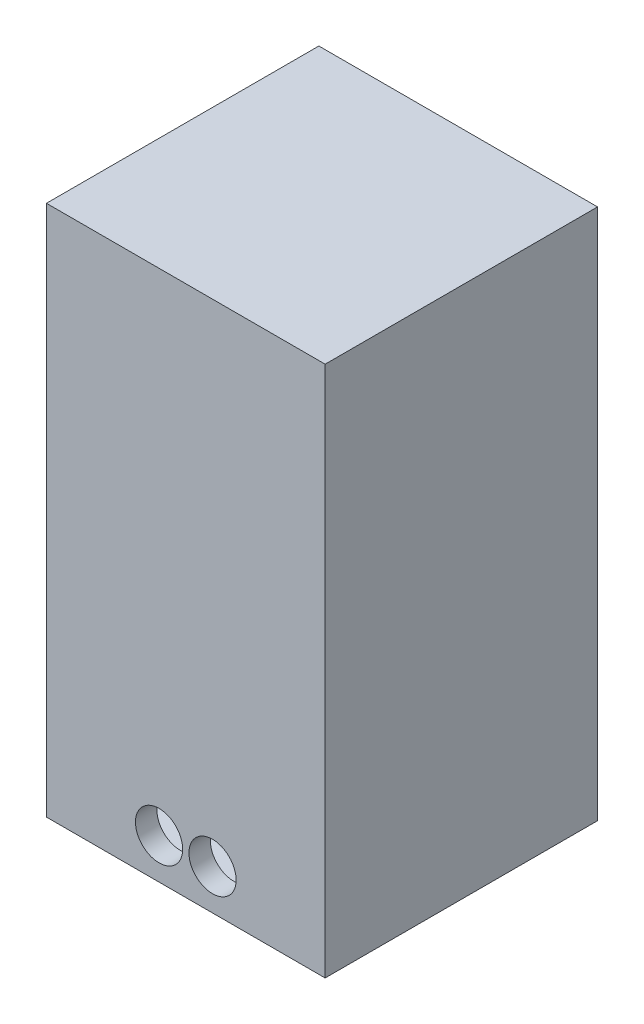
ISO-10303-21;
HEADER;
FILE_DESCRIPTION(('STEP AP214'),'2;1');
FILE_NAME('part.step','',(''),(''),'','','');
FILE_SCHEMA(('AUTOMOTIVE_DESIGN { 1 0 10303 214 1 1 1 1 }'));
ENDSEC;
DATA;
#1=APPLICATION_CONTEXT('core data for automotive mechanical design processes');
#2=APPLICATION_PROTOCOL_DEFINITION('international standard','automotive_design',2000,#1);
#3=PRODUCT_CONTEXT('',#1,'mechanical');
#4=PRODUCT('Part','Part','',(#3));
#5=PRODUCT_RELATED_PRODUCT_CATEGORY('part','',(#4));
#6=PRODUCT_DEFINITION_FORMATION('','',#4);
#7=PRODUCT_DEFINITION_CONTEXT('part definition',#1,'design');
#8=PRODUCT_DEFINITION('design','',#6,#7);
#9=PRODUCT_DEFINITION_SHAPE('','',#8);
#10=(LENGTH_UNIT() NAMED_UNIT(*) SI_UNIT(.MILLI.,.METRE.));
#11=(NAMED_UNIT(*) PLANE_ANGLE_UNIT() SI_UNIT($,.RADIAN.));
#12=(NAMED_UNIT(*) SI_UNIT($,.STERADIAN.) SOLID_ANGLE_UNIT());
#13=UNCERTAINTY_MEASURE_WITH_UNIT(LENGTH_MEASURE(1.E-05),#10,'distance_accuracy_value','');
#14=(GEOMETRIC_REPRESENTATION_CONTEXT(3) GLOBAL_UNCERTAINTY_ASSIGNED_CONTEXT((#13)) GLOBAL_UNIT_ASSIGNED_CONTEXT((#10,
#11,#12)) REPRESENTATION_CONTEXT('',''));
#15=CARTESIAN_POINT('',(0.,0.,0.));
#16=DIRECTION('',(0.,0.,1.));
#17=DIRECTION('',(1.,0.,0.));
#18=AXIS2_PLACEMENT_3D('',#15,#16,#17);
#19=CARTESIAN_POINT('',(0.,0.,433.));
#20=DIRECTION('',(0.,0.,1.));
#21=DIRECTION('',(1.,0.,0.));
#22=AXIS2_PLACEMENT_3D('',#19,#20,#21);
#23=PLANE('',#22);
#24=DIRECTION('',(-1.,0.,0.));
#25=VECTOR('',#24,1.);
#26=CARTESIAN_POINT('',(443.,1672.,433.));
#27=LINE('',#26,#25);
#28=CARTESIAN_POINT('',(443.,1672.,433.));
#29=VERTEX_POINT('',#28);
#30=CARTESIAN_POINT('',(-443.,1672.,433.));
#31=VERTEX_POINT('',#30);
#32=EDGE_CURVE('E249',#29,#31,#27,.T.);
#33=ORIENTED_EDGE('',*,*,#32,.T.);
#34=DIRECTION('',(0.,-1.,0.));
#35=VECTOR('',#34,1.);
#36=CARTESIAN_POINT('',(-443.,1672.,433.));
#37=LINE('',#36,#35);
#38=CARTESIAN_POINT('',(-443.,-18.,433.));
#39=VERTEX_POINT('',#38);
#40=EDGE_CURVE('E275',#31,#39,#37,.T.);
#41=ORIENTED_EDGE('',*,*,#40,.T.);
#42=DIRECTION('',(1.,0.,0.));
#43=VECTOR('',#42,1.);
#44=CARTESIAN_POINT('',(-443.,-18.,433.));
#45=LINE('',#44,#43);
#46=CARTESIAN_POINT('',(443.,-18.,433.));
#47=VERTEX_POINT('',#46);
#48=EDGE_CURVE('E273',#39,#47,#45,.T.);
#49=ORIENTED_EDGE('',*,*,#48,.T.);
#50=DIRECTION('',(0.,1.,0.));
#51=VECTOR('',#50,1.);
#52=CARTESIAN_POINT('',(443.,-18.,433.));
#53=LINE('',#52,#51);
#54=EDGE_CURVE('E259',#47,#29,#53,.T.);
#55=ORIENTED_EDGE('',*,*,#54,.T.);
#56=EDGE_LOOP('',(#33,#41,#49,#55));
#57=FACE_BOUND('',#56,.T.);
#58=CARTESIAN_POINT('',(-85.,110.,433.));
#59=DIRECTION('',(0.,0.,-1.));
#60=DIRECTION('',(-1.,0.,0.));
#61=AXIS2_PLACEMENT_3D('',#58,#59,#60);
#62=CIRCLE('',#61,75.);
#63=CARTESIAN_POINT('',(-160.,110.,433.));
#64=VERTEX_POINT('',#63);
#65=EDGE_CURVE('E427',#64,#64,#62,.T.);
#66=ORIENTED_EDGE('',*,*,#65,.T.);
#67=EDGE_LOOP('',(#66));
#68=FACE_BOUND('',#67,.T.);
#69=CARTESIAN_POINT('',(85.,110.,433.));
#70=DIRECTION('',(0.,0.,-1.));
#71=DIRECTION('',(-1.,0.,0.));
#72=AXIS2_PLACEMENT_3D('',#69,#70,#71);
#73=CIRCLE('',#72,75.);
#74=CARTESIAN_POINT('',(9.99999999999998,110.,433.));
#75=VERTEX_POINT('',#74);
#76=EDGE_CURVE('E417',#75,#75,#73,.T.);
#77=ORIENTED_EDGE('',*,*,#76,.T.);
#78=EDGE_LOOP('',(#77));
#79=FACE_BOUND('',#78,.T.);
#80=ADVANCED_FACE('F39',(#57,#68,#79),#23,.T.);
#81=CARTESIAN_POINT('',(425.,1647.,-415.));
#82=DIRECTION('',(0.,0.,-1.));
#83=DIRECTION('',(0.,1.,0.));
#84=AXIS2_PLACEMENT_3D('',#81,#82,#83);
#85=PLANE('',#84);
#86=DIRECTION('',(1.,0.,0.));
#87=VECTOR('',#86,1.);
#88=CARTESIAN_POINT('',(425.,1630.,-415.));
#89=LINE('',#88,#87);
#90=CARTESIAN_POINT('',(-285.,1630.,-415.));
#91=VERTEX_POINT('',#90);
#92=CARTESIAN_POINT('',(285.,1630.,-415.));
#93=VERTEX_POINT('',#92);
#94=EDGE_CURVE('E50',#91,#93,#89,.T.);
#95=ORIENTED_EDGE('',*,*,#94,.T.);
#96=CARTESIAN_POINT('',(285.,1615.,-415.));
#97=DIRECTION('',(0.,0.,-1.));
#98=DIRECTION('',(0.,1.,0.));
#99=AXIS2_PLACEMENT_3D('',#96,#97,#98);
#100=CIRCLE('',#99,15.0000000000001);
#101=CARTESIAN_POINT('',(300.,1615.,-415.));
#102=VERTEX_POINT('',#101);
#103=EDGE_CURVE('E11',#93,#102,#100,.T.);
#104=ORIENTED_EDGE('',*,*,#103,.T.);
#105=DIRECTION('',(0.,-1.,0.));
#106=VECTOR('',#105,1.);
#107=CARTESIAN_POINT('',(300.,1647.,-415.));
#108=LINE('',#107,#106);
#109=CARTESIAN_POINT('',(300.,1605.,-415.));
#110=VERTEX_POINT('',#109);
#111=EDGE_CURVE('E285',#102,#110,#108,.T.);
#112=ORIENTED_EDGE('',*,*,#111,.T.);
#113=CARTESIAN_POINT('',(285.,1605.,-415.));
#114=DIRECTION('',(0.,0.,-1.));
#115=DIRECTION('',(0.,1.,0.));
#116=AXIS2_PLACEMENT_3D('',#113,#114,#115);
#117=CIRCLE('',#116,14.9999999999997);
#118=CARTESIAN_POINT('',(285.,1590.,-415.));
#119=VERTEX_POINT('',#118);
#120=EDGE_CURVE('E287',#110,#119,#117,.T.);
#121=ORIENTED_EDGE('',*,*,#120,.T.);
#122=DIRECTION('',(-1.,0.,0.));
#123=VECTOR('',#122,1.);
#124=CARTESIAN_POINT('',(425.,1590.,-415.));
#125=LINE('',#124,#123);
#126=CARTESIAN_POINT('',(-285.,1590.,-415.));
#127=VERTEX_POINT('',#126);
#128=EDGE_CURVE('E291',#119,#127,#125,.T.);
#129=ORIENTED_EDGE('',*,*,#128,.T.);
#130=CARTESIAN_POINT('',(-285.,1605.,-415.));
#131=DIRECTION('',(0.,0.,-1.));
#132=DIRECTION('',(0.,1.,0.));
#133=AXIS2_PLACEMENT_3D('',#130,#131,#132);
#134=CIRCLE('',#133,14.9999999999997);
#135=CARTESIAN_POINT('',(-300.,1605.,-415.));
#136=VERTEX_POINT('',#135);
#137=EDGE_CURVE('E298',#127,#136,#134,.T.);
#138=ORIENTED_EDGE('',*,*,#137,.T.);
#139=DIRECTION('',(0.,1.,0.));
#140=VECTOR('',#139,1.);
#141=CARTESIAN_POINT('',(-299.999999999999,1647.,-415.));
#142=LINE('',#141,#140);
#143=CARTESIAN_POINT('',(-300.,1615.,-415.));
#144=VERTEX_POINT('',#143);
#145=EDGE_CURVE('E299',#136,#144,#142,.T.);
#146=ORIENTED_EDGE('',*,*,#145,.T.);
#147=CARTESIAN_POINT('',(-285.,1615.,-415.));
#148=DIRECTION('',(0.,0.,-1.));
#149=DIRECTION('',(0.,1.,0.));
#150=AXIS2_PLACEMENT_3D('',#147,#148,#149);
#151=CIRCLE('',#150,15.);
#152=EDGE_CURVE('E305',#144,#91,#151,.T.);
#153=ORIENTED_EDGE('',*,*,#152,.T.);
#154=EDGE_LOOP('',(#95,#104,#112,#121,#129,#138,#146,#153));
#155=FACE_BOUND('',#154,.T.);
#156=DIRECTION('',(0.,-1.,0.));
#157=VECTOR('',#156,1.);
#158=CARTESIAN_POINT('',(-425.,1647.,-415.));
#159=LINE('',#158,#157);
#160=CARTESIAN_POINT('',(-425.,1647.,-415.));
#161=VERTEX_POINT('',#160);
#162=CARTESIAN_POINT('',(-425.,6.9999999999999,-415.));
#163=VERTEX_POINT('',#162);
#164=EDGE_CURVE('E208',#161,#163,#159,.T.);
#165=ORIENTED_EDGE('',*,*,#164,.T.);
#166=DIRECTION('',(-1.,0.,0.));
#167=VECTOR('',#166,1.);
#168=CARTESIAN_POINT('',(425.,6.9999999999999,-415.));
#169=LINE('',#168,#167);
#170=CARTESIAN_POINT('',(425.,6.9999999999999,-415.));
#171=VERTEX_POINT('',#170);
#172=EDGE_CURVE('E240',#171,#163,#169,.T.);
#173=ORIENTED_EDGE('',*,*,#172,.F.);
#174=DIRECTION('',(0.,-1.,0.));
#175=VECTOR('',#174,1.);
#176=CARTESIAN_POINT('',(425.,1647.,-415.));
#177=LINE('',#176,#175);
#178=CARTESIAN_POINT('',(425.,1647.,-415.));
#179=VERTEX_POINT('',#178);
#180=EDGE_CURVE('E224',#179,#171,#177,.T.);
#181=ORIENTED_EDGE('',*,*,#180,.F.);
#182=DIRECTION('',(-1.,0.,0.));
#183=VECTOR('',#182,1.);
#184=CARTESIAN_POINT('',(425.,1647.,-415.));
#185=LINE('',#184,#183);
#186=EDGE_CURVE('E247',#179,#161,#185,.T.);
#187=ORIENTED_EDGE('',*,*,#186,.T.);
#188=EDGE_LOOP('',(#165,#173,#181,#187));
#189=FACE_BOUND('',#188,.T.);
#190=ADVANCED_FACE('F306',(#155,#189),#85,.F.);
#191=CARTESIAN_POINT('',(425.,1647.,415.));
#192=DIRECTION('',(0.,1.,0.));
#193=DIRECTION('',(0.,0.,1.));
#194=AXIS2_PLACEMENT_3D('',#191,#192,#193);
#195=PLANE('',#194);
#196=DIRECTION('',(0.,0.,-1.));
#197=VECTOR('',#196,1.);
#198=CARTESIAN_POINT('',(-425.,1647.,415.));
#199=LINE('',#198,#197);
#200=CARTESIAN_POINT('',(-425.,1647.,415.));
#201=VERTEX_POINT('',#200);
#202=EDGE_CURVE('E226',#201,#161,#199,.T.);
#203=ORIENTED_EDGE('',*,*,#202,.T.);
#204=ORIENTED_EDGE('',*,*,#186,.F.);
#205=DIRECTION('',(0.,0.,-1.));
#206=VECTOR('',#205,1.);
#207=CARTESIAN_POINT('',(425.,1647.,415.));
#208=LINE('',#207,#206);
#209=CARTESIAN_POINT('',(425.,1647.,415.));
#210=VERTEX_POINT('',#209);
#211=EDGE_CURVE('E234',#210,#179,#208,.T.);
#212=ORIENTED_EDGE('',*,*,#211,.F.);
#213=DIRECTION('',(-1.,0.,0.));
#214=VECTOR('',#213,1.);
#215=CARTESIAN_POINT('',(425.,1647.,415.));
#216=LINE('',#215,#214);
#217=EDGE_CURVE('E252',#210,#201,#216,.T.);
#218=ORIENTED_EDGE('',*,*,#217,.T.);
#219=EDGE_LOOP('',(#203,#204,#212,#218));
#220=FACE_BOUND('',#219,.T.);
#221=ADVANCED_FACE('F346',(#220),#195,.F.);
#222=CARTESIAN_POINT('',(425.,6.9999999999999,415.));
#223=DIRECTION('',(0.,0.,1.));
#224=DIRECTION('',(0.,-1.,0.));
#225=AXIS2_PLACEMENT_3D('',#222,#223,#224);
#226=PLANE('',#225);
#227=CARTESIAN_POINT('',(-85.,110.,415.));
#228=DIRECTION('',(0.,0.,-1.));
#229=DIRECTION('',(1.,0.,0.));
#230=AXIS2_PLACEMENT_3D('',#227,#228,#229);
#231=CIRCLE('',#230,90.);
#232=CARTESIAN_POINT('',(0.,80.419601084502,415.));
#233=VERTEX_POINT('',#232);
#234=CARTESIAN_POINT('',(0.,139.580398915498,415.));
#235=VERTEX_POINT('',#234);
#236=EDGE_CURVE('E179',#233,#235,#231,.T.);
#237=ORIENTED_EDGE('',*,*,#236,.F.);
#238=CARTESIAN_POINT('',(85.,110.,415.));
#239=DIRECTION('',(0.,0.,-1.));
#240=DIRECTION('',(1.,0.,0.));
#241=AXIS2_PLACEMENT_3D('',#238,#239,#240);
#242=CIRCLE('',#241,90.);
#243=EDGE_CURVE('E52',#235,#233,#242,.T.);
#244=ORIENTED_EDGE('',*,*,#243,.F.);
#245=EDGE_LOOP('',(#237,#244));
#246=FACE_BOUND('',#245,.T.);
#247=DIRECTION('',(0.,1.,0.));
#248=VECTOR('',#247,1.);
#249=CARTESIAN_POINT('',(-425.,6.9999999999999,415.));
#250=LINE('',#249,#248);
#251=CARTESIAN_POINT('',(-425.,6.9999999999999,415.));
#252=VERTEX_POINT('',#251);
#253=EDGE_CURVE('E243',#252,#201,#250,.T.);
#254=ORIENTED_EDGE('',*,*,#253,.T.);
#255=ORIENTED_EDGE('',*,*,#217,.F.);
#256=DIRECTION('',(0.,1.,0.));
#257=VECTOR('',#256,1.);
#258=CARTESIAN_POINT('',(425.,6.9999999999999,415.));
#259=LINE('',#258,#257);
#260=CARTESIAN_POINT('',(425.,6.9999999999999,415.));
#261=VERTEX_POINT('',#260);
#262=EDGE_CURVE('E233',#261,#210,#259,.T.);
#263=ORIENTED_EDGE('',*,*,#262,.F.);
#264=DIRECTION('',(-1.,0.,0.));
#265=VECTOR('',#264,1.);
#266=CARTESIAN_POINT('',(425.,6.9999999999999,415.));
#267=LINE('',#266,#265);
#268=EDGE_CURVE('E254',#261,#252,#267,.T.);
#269=ORIENTED_EDGE('',*,*,#268,.T.);
#270=EDGE_LOOP('',(#254,#255,#263,#269));
#271=FACE_BOUND('',#270,.T.);
#272=ADVANCED_FACE('F538',(#246,#271),#226,.F.);
#273=CARTESIAN_POINT('',(425.,6.9999999999999,-415.));
#274=DIRECTION('',(0.,-1.,0.));
#275=DIRECTION('',(0.,0.,-1.));
#276=AXIS2_PLACEMENT_3D('',#273,#274,#275);
#277=PLANE('',#276);
#278=DIRECTION('',(0.,0.,1.));
#279=VECTOR('',#278,1.);
#280=CARTESIAN_POINT('',(-425.,6.9999999999999,-415.));
#281=LINE('',#280,#279);
#282=EDGE_CURVE('E239',#163,#252,#281,.T.);
#283=ORIENTED_EDGE('',*,*,#282,.T.);
#284=ORIENTED_EDGE('',*,*,#268,.F.);
#285=DIRECTION('',(0.,0.,1.));
#286=VECTOR('',#285,1.);
#287=CARTESIAN_POINT('',(425.,6.9999999999999,-415.));
#288=LINE('',#287,#286);
#289=EDGE_CURVE('E227',#171,#261,#288,.T.);
#290=ORIENTED_EDGE('',*,*,#289,.F.);
#291=ORIENTED_EDGE('',*,*,#172,.T.);
#292=EDGE_LOOP('',(#283,#284,#290,#291));
#293=FACE_BOUND('',#292,.T.);
#294=ADVANCED_FACE('F527',(#293),#277,.F.);
#295=CARTESIAN_POINT('',(425.,0.,0.));
#296=DIRECTION('',(-1.,0.,0.));
#297=DIRECTION('',(0.,0.,1.));
#298=AXIS2_PLACEMENT_3D('',#295,#296,#297);
#299=PLANE('',#298);
#300=ORIENTED_EDGE('',*,*,#180,.T.);
#301=ORIENTED_EDGE('',*,*,#289,.T.);
#302=ORIENTED_EDGE('',*,*,#262,.T.);
#303=ORIENTED_EDGE('',*,*,#211,.T.);
#304=EDGE_LOOP('',(#300,#301,#302,#303));
#305=FACE_BOUND('',#304,.T.);
#306=ADVANCED_FACE('F337',(#305),#299,.T.);
#307=CARTESIAN_POINT('',(-425.,0.,0.));
#308=DIRECTION('',(-1.,0.,0.));
#309=DIRECTION('',(0.,0.,1.));
#310=AXIS2_PLACEMENT_3D('',#307,#308,#309);
#311=PLANE('',#310);
#312=ORIENTED_EDGE('',*,*,#164,.F.);
#313=ORIENTED_EDGE('',*,*,#202,.F.);
#314=ORIENTED_EDGE('',*,*,#253,.F.);
#315=ORIENTED_EDGE('',*,*,#282,.F.);
#316=EDGE_LOOP('',(#312,#313,#314,#315));
#317=FACE_BOUND('',#316,.T.);
#318=ADVANCED_FACE('F326',(#317),#311,.F.);
#319=CARTESIAN_POINT('',(285.,1615.,-145.));
#320=DIRECTION('',(0.,0.,-1.));
#321=DIRECTION('',(-1.,0.,0.));
#322=AXIS2_PLACEMENT_3D('',#319,#320,#321);
#323=CYLINDRICAL_SURFACE('',#322,15.0000000000001);
#324=DIRECTION('',(0.,0.,-1.));
#325=VECTOR('',#324,1.);
#326=CARTESIAN_POINT('',(285.,1630.,-145.));
#327=LINE('',#326,#325);
#328=CARTESIAN_POINT('',(285.,1630.,-433.));
#329=VERTEX_POINT('',#328);
#330=EDGE_CURVE('E206',#93,#329,#327,.T.);
#331=ORIENTED_EDGE('',*,*,#330,.T.);
#332=CARTESIAN_POINT('',(285.,1615.,-433.));
#333=DIRECTION('',(0.,0.,-1.));
#334=DIRECTION('',(-1.,0.,0.));
#335=AXIS2_PLACEMENT_3D('',#332,#333,#334);
#336=CIRCLE('',#335,15.0000000000001);
#337=CARTESIAN_POINT('',(300.,1615.,-433.));
#338=VERTEX_POINT('',#337);
#339=EDGE_CURVE('E61',#329,#338,#336,.T.);
#340=ORIENTED_EDGE('',*,*,#339,.T.);
#341=DIRECTION('',(0.,0.,-1.));
#342=VECTOR('',#341,1.);
#343=CARTESIAN_POINT('',(300.,1615.,-145.));
#344=LINE('',#343,#342);
#345=EDGE_CURVE('E210',#102,#338,#344,.T.);
#346=ORIENTED_EDGE('',*,*,#345,.F.);
#347=ORIENTED_EDGE('',*,*,#103,.F.);
#348=EDGE_LOOP('',(#331,#340,#346,#347));
#349=FACE_BOUND('',#348,.T.);
#350=ADVANCED_FACE('F328',(#349),#323,.F.);
#351=CARTESIAN_POINT('',(-285.,1630.,-145.));
#352=DIRECTION('',(0.,1.,0.));
#353=DIRECTION('',(0.,0.,1.));
#354=AXIS2_PLACEMENT_3D('',#351,#352,#353);
#355=PLANE('',#354);
#356=DIRECTION('',(0.,0.,-1.));
#357=VECTOR('',#356,1.);
#358=CARTESIAN_POINT('',(-285.,1630.,-145.));
#359=LINE('',#358,#357);
#360=CARTESIAN_POINT('',(-285.,1630.,-433.));
#361=VERTEX_POINT('',#360);
#362=EDGE_CURVE('E211',#91,#361,#359,.T.);
#363=ORIENTED_EDGE('',*,*,#362,.T.);
#364=DIRECTION('',(1.,0.,0.));
#365=VECTOR('',#364,1.);
#366=CARTESIAN_POINT('',(-285.,1630.,-433.));
#367=LINE('',#366,#365);
#368=EDGE_CURVE('E204',#361,#329,#367,.T.);
#369=ORIENTED_EDGE('',*,*,#368,.T.);
#370=ORIENTED_EDGE('',*,*,#330,.F.);
#371=ORIENTED_EDGE('',*,*,#94,.F.);
#372=EDGE_LOOP('',(#363,#369,#370,#371));
#373=FACE_BOUND('',#372,.T.);
#374=ADVANCED_FACE('F311',(#373),#355,.F.);
#375=CARTESIAN_POINT('',(-285.,1615.,-145.));
#376=DIRECTION('',(0.,0.,-1.));
#377=DIRECTION('',(-1.,0.,0.));
#378=AXIS2_PLACEMENT_3D('',#375,#376,#377);
#379=CYLINDRICAL_SURFACE('',#378,15.);
#380=DIRECTION('',(0.,0.,-1.));
#381=VECTOR('',#380,1.);
#382=CARTESIAN_POINT('',(-300.,1615.,-145.));
#383=LINE('',#382,#381);
#384=CARTESIAN_POINT('',(-300.,1615.,-433.));
#385=VERTEX_POINT('',#384);
#386=EDGE_CURVE('E212',#144,#385,#383,.T.);
#387=ORIENTED_EDGE('',*,*,#386,.T.);
#388=CARTESIAN_POINT('',(-285.,1615.,-433.));
#389=DIRECTION('',(0.,0.,-1.));
#390=DIRECTION('',(-1.,0.,0.));
#391=AXIS2_PLACEMENT_3D('',#388,#389,#390);
#392=CIRCLE('',#391,15.);
#393=EDGE_CURVE('E203',#385,#361,#392,.T.);
#394=ORIENTED_EDGE('',*,*,#393,.T.);
#395=ORIENTED_EDGE('',*,*,#362,.F.);
#396=ORIENTED_EDGE('',*,*,#152,.F.);
#397=EDGE_LOOP('',(#387,#394,#395,#396));
#398=FACE_BOUND('',#397,.T.);
#399=ADVANCED_FACE('F312',(#398),#379,.F.);
#400=CARTESIAN_POINT('',(-300.,1605.,-145.));
#401=DIRECTION('',(-1.,0.,0.));
#402=DIRECTION('',(0.,-1.,0.));
#403=AXIS2_PLACEMENT_3D('',#400,#401,#402);
#404=PLANE('',#403);
#405=DIRECTION('',(0.,0.,-1.));
#406=VECTOR('',#405,1.);
#407=CARTESIAN_POINT('',(-300.,1605.,-145.));
#408=LINE('',#407,#406);
#409=CARTESIAN_POINT('',(-300.,1605.,-433.));
#410=VERTEX_POINT('',#409);
#411=EDGE_CURVE('E214',#136,#410,#408,.T.);
#412=ORIENTED_EDGE('',*,*,#411,.T.);
#413=DIRECTION('',(0.,1.,0.));
#414=VECTOR('',#413,1.);
#415=CARTESIAN_POINT('',(-300.,1605.,-433.));
#416=LINE('',#415,#414);
#417=EDGE_CURVE('E196',#410,#385,#416,.T.);
#418=ORIENTED_EDGE('',*,*,#417,.T.);
#419=ORIENTED_EDGE('',*,*,#386,.F.);
#420=ORIENTED_EDGE('',*,*,#145,.F.);
#421=EDGE_LOOP('',(#412,#418,#419,#420));
#422=FACE_BOUND('',#421,.T.);
#423=ADVANCED_FACE('F396',(#422),#404,.F.);
#424=CARTESIAN_POINT('',(-285.,1605.,-145.));
#425=DIRECTION('',(0.,0.,-1.));
#426=DIRECTION('',(-1.,0.,0.));
#427=AXIS2_PLACEMENT_3D('',#424,#425,#426);
#428=CYLINDRICAL_SURFACE('',#427,14.9999999999997);
#429=DIRECTION('',(0.,0.,-1.));
#430=VECTOR('',#429,1.);
#431=CARTESIAN_POINT('',(-285.,1590.,-145.));
#432=LINE('',#431,#430);
#433=CARTESIAN_POINT('',(-285.,1590.,-433.));
#434=VERTEX_POINT('',#433);
#435=EDGE_CURVE('E220',#127,#434,#432,.T.);
#436=ORIENTED_EDGE('',*,*,#435,.T.);
#437=CARTESIAN_POINT('',(-285.,1605.,-433.));
#438=DIRECTION('',(0.,0.,-1.));
#439=DIRECTION('',(-1.,0.,0.));
#440=AXIS2_PLACEMENT_3D('',#437,#438,#439);
#441=CIRCLE('',#440,14.9999999999997);
#442=EDGE_CURVE('E194',#434,#410,#441,.T.);
#443=ORIENTED_EDGE('',*,*,#442,.T.);
#444=ORIENTED_EDGE('',*,*,#411,.F.);
#445=ORIENTED_EDGE('',*,*,#137,.F.);
#446=EDGE_LOOP('',(#436,#443,#444,#445));
#447=FACE_BOUND('',#446,.T.);
#448=ADVANCED_FACE('F392',(#447),#428,.F.);
#449=CARTESIAN_POINT('',(285.,1590.,-145.));
#450=DIRECTION('',(0.,-1.,0.));
#451=DIRECTION('',(0.,0.,-1.));
#452=AXIS2_PLACEMENT_3D('',#449,#450,#451);
#453=PLANE('',#452);
#454=DIRECTION('',(0.,0.,-1.));
#455=VECTOR('',#454,1.);
#456=CARTESIAN_POINT('',(285.,1590.,-145.));
#457=LINE('',#456,#455);
#458=CARTESIAN_POINT('',(285.,1590.,-433.));
#459=VERTEX_POINT('',#458);
#460=EDGE_CURVE('E217',#119,#459,#457,.T.);
#461=ORIENTED_EDGE('',*,*,#460,.T.);
#462=DIRECTION('',(-1.,0.,0.));
#463=VECTOR('',#462,1.);
#464=CARTESIAN_POINT('',(285.,1590.,-433.));
#465=LINE('',#464,#463);
#466=EDGE_CURVE('E195',#459,#434,#465,.T.);
#467=ORIENTED_EDGE('',*,*,#466,.T.);
#468=ORIENTED_EDGE('',*,*,#435,.F.);
#469=ORIENTED_EDGE('',*,*,#128,.F.);
#470=EDGE_LOOP('',(#461,#467,#468,#469));
#471=FACE_BOUND('',#470,.T.);
#472=ADVANCED_FACE('F387',(#471),#453,.F.);
#473=CARTESIAN_POINT('',(285.,1605.,-145.));
#474=DIRECTION('',(0.,0.,-1.));
#475=DIRECTION('',(-1.,0.,0.));
#476=AXIS2_PLACEMENT_3D('',#473,#474,#475);
#477=CYLINDRICAL_SURFACE('',#476,14.9999999999997);
#478=DIRECTION('',(0.,0.,-1.));
#479=VECTOR('',#478,1.);
#480=CARTESIAN_POINT('',(300.,1605.,-145.));
#481=LINE('',#480,#479);
#482=CARTESIAN_POINT('',(300.,1605.,-433.));
#483=VERTEX_POINT('',#482);
#484=EDGE_CURVE('E223',#110,#483,#481,.T.);
#485=ORIENTED_EDGE('',*,*,#484,.T.);
#486=CARTESIAN_POINT('',(285.,1605.,-433.));
#487=DIRECTION('',(0.,0.,-1.));
#488=DIRECTION('',(-1.,0.,0.));
#489=AXIS2_PLACEMENT_3D('',#486,#487,#488);
#490=CIRCLE('',#489,14.9999999999997);
#491=EDGE_CURVE('E186',#483,#459,#490,.T.);
#492=ORIENTED_EDGE('',*,*,#491,.T.);
#493=ORIENTED_EDGE('',*,*,#460,.F.);
#494=ORIENTED_EDGE('',*,*,#120,.F.);
#495=EDGE_LOOP('',(#485,#492,#493,#494));
#496=FACE_BOUND('',#495,.T.);
#497=ADVANCED_FACE('F381',(#496),#477,.F.);
#498=CARTESIAN_POINT('',(300.,1615.,-145.));
#499=DIRECTION('',(1.,0.,0.));
#500=DIRECTION('',(0.,1.,0.));
#501=AXIS2_PLACEMENT_3D('',#498,#499,#500);
#502=PLANE('',#501);
#503=ORIENTED_EDGE('',*,*,#345,.T.);
#504=DIRECTION('',(0.,-1.,0.));
#505=VECTOR('',#504,1.);
#506=CARTESIAN_POINT('',(300.,1615.,-433.));
#507=LINE('',#506,#505);
#508=EDGE_CURVE('E185',#338,#483,#507,.T.);
#509=ORIENTED_EDGE('',*,*,#508,.T.);
#510=ORIENTED_EDGE('',*,*,#484,.F.);
#511=ORIENTED_EDGE('',*,*,#111,.F.);
#512=EDGE_LOOP('',(#503,#509,#510,#511));
#513=FACE_BOUND('',#512,.T.);
#514=ADVANCED_FACE('F323',(#513),#502,.F.);
#515=CARTESIAN_POINT('',(0.,0.,-433.));
#516=DIRECTION('',(0.,0.,1.));
#517=DIRECTION('',(1.,0.,0.));
#518=AXIS2_PLACEMENT_3D('',#515,#516,#517);
#519=PLANE('',#518);
#520=DIRECTION('',(-1.,0.,0.));
#521=VECTOR('',#520,1.);
#522=CARTESIAN_POINT('',(443.,1672.,-433.));
#523=LINE('',#522,#521);
#524=CARTESIAN_POINT('',(443.,1672.,-433.));
#525=VERTEX_POINT('',#524);
#526=CARTESIAN_POINT('',(-443.,1672.,-433.));
#527=VERTEX_POINT('',#526);
#528=EDGE_CURVE('E256',#525,#527,#523,.T.);
#529=ORIENTED_EDGE('',*,*,#528,.F.);
#530=DIRECTION('',(0.,1.,0.));
#531=VECTOR('',#530,1.);
#532=CARTESIAN_POINT('',(443.,-18.,-433.));
#533=LINE('',#532,#531);
#534=CARTESIAN_POINT('',(443.,-18.,-433.));
#535=VERTEX_POINT('',#534);
#536=EDGE_CURVE('E268',#535,#525,#533,.T.);
#537=ORIENTED_EDGE('',*,*,#536,.F.);
#538=DIRECTION('',(1.,0.,0.));
#539=VECTOR('',#538,1.);
#540=CARTESIAN_POINT('',(-443.,-18.,-433.));
#541=LINE('',#540,#539);
#542=CARTESIAN_POINT('',(-443.,-18.,-433.));
#543=VERTEX_POINT('',#542);
#544=EDGE_CURVE('E261',#543,#535,#541,.T.);
#545=ORIENTED_EDGE('',*,*,#544,.F.);
#546=DIRECTION('',(0.,-1.,0.));
#547=VECTOR('',#546,1.);
#548=CARTESIAN_POINT('',(-443.,1672.,-433.));
#549=LINE('',#548,#547);
#550=EDGE_CURVE('E258',#527,#543,#549,.T.);
#551=ORIENTED_EDGE('',*,*,#550,.F.);
#552=EDGE_LOOP('',(#529,#537,#545,#551));
#553=FACE_BOUND('',#552,.T.);
#554=ORIENTED_EDGE('',*,*,#339,.F.);
#555=ORIENTED_EDGE('',*,*,#368,.F.);
#556=ORIENTED_EDGE('',*,*,#393,.F.);
#557=ORIENTED_EDGE('',*,*,#417,.F.);
#558=ORIENTED_EDGE('',*,*,#442,.F.);
#559=ORIENTED_EDGE('',*,*,#466,.F.);
#560=ORIENTED_EDGE('',*,*,#491,.F.);
#561=ORIENTED_EDGE('',*,*,#508,.F.);
#562=EDGE_LOOP('',(#554,#555,#556,#557,#558,#559,#560,#561));
#563=FACE_BOUND('',#562,.T.);
#564=ADVANCED_FACE('F316',(#553,#563),#519,.F.);
#565=CARTESIAN_POINT('',(443.,1672.,-433.));
#566=DIRECTION('',(0.,1.,0.));
#567=DIRECTION('',(-1.,0.,0.));
#568=AXIS2_PLACEMENT_3D('',#565,#566,#567);
#569=PLANE('',#568);
#570=ORIENTED_EDGE('',*,*,#32,.F.);
#571=DIRECTION('',(0.,0.,1.));
#572=VECTOR('',#571,1.);
#573=CARTESIAN_POINT('',(443.,1672.,-433.));
#574=LINE('',#573,#572);
#575=EDGE_CURVE('E279',#525,#29,#574,.T.);
#576=ORIENTED_EDGE('',*,*,#575,.F.);
#577=ORIENTED_EDGE('',*,*,#528,.T.);
#578=DIRECTION('',(0.,0.,1.));
#579=VECTOR('',#578,1.);
#580=CARTESIAN_POINT('',(-443.,1672.,-433.));
#581=LINE('',#580,#579);
#582=EDGE_CURVE('E269',#527,#31,#581,.T.);
#583=ORIENTED_EDGE('',*,*,#582,.T.);
#584=EDGE_LOOP('',(#570,#576,#577,#583));
#585=FACE_BOUND('',#584,.T.);
#586=ADVANCED_FACE('F41',(#585),#569,.T.);
#587=CARTESIAN_POINT('',(443.,-18.,-433.));
#588=DIRECTION('',(1.,0.,0.));
#589=DIRECTION('',(0.,0.,-1.));
#590=AXIS2_PLACEMENT_3D('',#587,#588,#589);
#591=PLANE('',#590);
#592=ORIENTED_EDGE('',*,*,#54,.F.);
#593=DIRECTION('',(0.,0.,1.));
#594=VECTOR('',#593,1.);
#595=CARTESIAN_POINT('',(443.,-18.,-433.));
#596=LINE('',#595,#594);
#597=EDGE_CURVE('E281',#535,#47,#596,.T.);
#598=ORIENTED_EDGE('',*,*,#597,.F.);
#599=ORIENTED_EDGE('',*,*,#536,.T.);
#600=ORIENTED_EDGE('',*,*,#575,.T.);
#601=EDGE_LOOP('',(#592,#598,#599,#600));
#602=FACE_BOUND('',#601,.T.);
#603=ADVANCED_FACE('F351',(#602),#591,.T.);
#604=CARTESIAN_POINT('',(-443.,-18.,-433.));
#605=DIRECTION('',(0.,-1.,0.));
#606=DIRECTION('',(0.,0.,-1.));
#607=AXIS2_PLACEMENT_3D('',#604,#605,#606);
#608=PLANE('',#607);
#609=ORIENTED_EDGE('',*,*,#48,.F.);
#610=DIRECTION('',(0.,0.,1.));
#611=VECTOR('',#610,1.);
#612=CARTESIAN_POINT('',(-443.,-18.,-433.));
#613=LINE('',#612,#611);
#614=EDGE_CURVE('E284',#543,#39,#613,.T.);
#615=ORIENTED_EDGE('',*,*,#614,.F.);
#616=ORIENTED_EDGE('',*,*,#544,.T.);
#617=ORIENTED_EDGE('',*,*,#597,.T.);
#618=EDGE_LOOP('',(#609,#615,#616,#617));
#619=FACE_BOUND('',#618,.T.);
#620=ADVANCED_FACE('F358',(#619),#608,.T.);
#621=CARTESIAN_POINT('',(-443.,1672.,-433.));
#622=DIRECTION('',(-1.,0.,0.));
#623=DIRECTION('',(0.,-1.,0.));
#624=AXIS2_PLACEMENT_3D('',#621,#622,#623);
#625=PLANE('',#624);
#626=ORIENTED_EDGE('',*,*,#40,.F.);
#627=ORIENTED_EDGE('',*,*,#582,.F.);
#628=ORIENTED_EDGE('',*,*,#550,.T.);
#629=ORIENTED_EDGE('',*,*,#614,.T.);
#630=EDGE_LOOP('',(#626,#627,#628,#629));
#631=FACE_BOUND('',#630,.T.);
#632=ADVANCED_FACE('F360',(#631),#625,.T.);
#633=CARTESIAN_POINT('',(-85.,110.,365.));
#634=DIRECTION('',(0.,0.,1.));
#635=DIRECTION('',(1.,0.,0.));
#636=AXIS2_PLACEMENT_3D('',#633,#634,#635);
#637=CYLINDRICAL_SURFACE('',#636,90.);
#638=ORIENTED_EDGE('',*,*,#236,.T.);
#639=DIRECTION('',(0.,0.,1.));
#640=VECTOR('',#639,1.);
#641=CARTESIAN_POINT('',(0.,139.580398915498,365.));
#642=LINE('',#641,#640);
#643=CARTESIAN_POINT('',(0.,139.580398915498,365.));
#644=VERTEX_POINT('',#643);
#645=EDGE_CURVE('E166',#644,#235,#642,.T.);
#646=ORIENTED_EDGE('',*,*,#645,.F.);
#647=CARTESIAN_POINT('',(-85.,110.,365.));
#648=DIRECTION('',(0.,0.,-1.));
#649=DIRECTION('',(1.,0.,0.));
#650=AXIS2_PLACEMENT_3D('',#647,#648,#649);
#651=CIRCLE('',#650,90.);
#652=CARTESIAN_POINT('',(0.,80.419601084502,365.));
#653=VERTEX_POINT('',#652);
#654=EDGE_CURVE('E172',#653,#644,#651,.T.);
#655=ORIENTED_EDGE('',*,*,#654,.F.);
#656=DIRECTION('',(0.,0.,1.));
#657=VECTOR('',#656,1.);
#658=CARTESIAN_POINT('',(0.,80.419601084502,365.));
#659=LINE('',#658,#657);
#660=EDGE_CURVE('E171',#653,#233,#659,.T.);
#661=ORIENTED_EDGE('',*,*,#660,.T.);
#662=EDGE_LOOP('',(#638,#646,#655,#661));
#663=FACE_BOUND('',#662,.T.);
#664=ADVANCED_FACE('F177',(#663),#637,.T.);
#665=CARTESIAN_POINT('',(85.,110.,365.));
#666=DIRECTION('',(0.,0.,1.));
#667=DIRECTION('',(1.,0.,0.));
#668=AXIS2_PLACEMENT_3D('',#665,#666,#667);
#669=CYLINDRICAL_SURFACE('',#668,90.);
#670=ORIENTED_EDGE('',*,*,#243,.T.);
#671=ORIENTED_EDGE('',*,*,#660,.F.);
#672=CARTESIAN_POINT('',(85.,110.,365.));
#673=DIRECTION('',(0.,0.,-1.));
#674=DIRECTION('',(1.,0.,0.));
#675=AXIS2_PLACEMENT_3D('',#672,#673,#674);
#676=CIRCLE('',#675,90.);
#677=EDGE_CURVE('E165',#644,#653,#676,.T.);
#678=ORIENTED_EDGE('',*,*,#677,.F.);
#679=ORIENTED_EDGE('',*,*,#645,.T.);
#680=EDGE_LOOP('',(#670,#671,#678,#679));
#681=FACE_BOUND('',#680,.T.);
#682=ADVANCED_FACE('F168',(#681),#669,.T.);
#683=CARTESIAN_POINT('',(0.,110.,365.));
#684=DIRECTION('',(0.,0.,1.));
#685=DIRECTION('',(1.,0.,0.));
#686=AXIS2_PLACEMENT_3D('',#683,#684,#685);
#687=PLANE('',#686);
#688=CARTESIAN_POINT('',(85.,110.,365.));
#689=DIRECTION('',(0.,0.,-1.));
#690=DIRECTION('',(-1.,0.,0.));
#691=AXIS2_PLACEMENT_3D('',#688,#689,#690);
#692=CIRCLE('',#691,75.);
#693=CARTESIAN_POINT('',(9.99999999999998,110.,365.));
#694=VERTEX_POINT('',#693);
#695=EDGE_CURVE('E421',#694,#694,#692,.T.);
#696=ORIENTED_EDGE('',*,*,#695,.F.);
#697=EDGE_LOOP('',(#696));
#698=FACE_BOUND('',#697,.T.);
#699=CARTESIAN_POINT('',(-85.,110.,365.));
#700=DIRECTION('',(0.,0.,-1.));
#701=DIRECTION('',(-1.,0.,0.));
#702=AXIS2_PLACEMENT_3D('',#699,#700,#701);
#703=CIRCLE('',#702,75.);
#704=CARTESIAN_POINT('',(-160.,110.,365.));
#705=VERTEX_POINT('',#704);
#706=EDGE_CURVE('E424',#705,#705,#703,.T.);
#707=ORIENTED_EDGE('',*,*,#706,.F.);
#708=EDGE_LOOP('',(#707));
#709=FACE_BOUND('',#708,.T.);
#710=ORIENTED_EDGE('',*,*,#654,.T.);
#711=ORIENTED_EDGE('',*,*,#677,.T.);
#712=EDGE_LOOP('',(#710,#711));
#713=FACE_BOUND('',#712,.T.);
#714=ADVANCED_FACE('F176',(#698,#709,#713),#687,.F.);
#715=CARTESIAN_POINT('',(-85.,110.,365.));
#716=DIRECTION('',(0.,0.,-1.));
#717=DIRECTION('',(-1.,0.,0.));
#718=AXIS2_PLACEMENT_3D('',#715,#716,#717);
#719=CYLINDRICAL_SURFACE('',#718,75.);
#720=ORIENTED_EDGE('',*,*,#65,.F.);
#721=EDGE_LOOP('',(#720));
#722=FACE_BOUND('',#721,.T.);
#723=ORIENTED_EDGE('',*,*,#706,.T.);
#724=EDGE_LOOP('',(#723));
#725=FACE_BOUND('',#724,.T.);
#726=ADVANCED_FACE('F410',(#722,#725),#719,.F.);
#727=CARTESIAN_POINT('',(85.,110.,365.));
#728=DIRECTION('',(0.,0.,-1.));
#729=DIRECTION('',(-1.,0.,0.));
#730=AXIS2_PLACEMENT_3D('',#727,#728,#729);
#731=CYLINDRICAL_SURFACE('',#730,75.);
#732=ORIENTED_EDGE('',*,*,#76,.F.);
#733=EDGE_LOOP('',(#732));
#734=FACE_BOUND('',#733,.T.);
#735=ORIENTED_EDGE('',*,*,#695,.T.);
#736=EDGE_LOOP('',(#735));
#737=FACE_BOUND('',#736,.T.);
#738=ADVANCED_FACE('F413',(#734,#737),#731,.F.);
#739=CLOSED_SHELL('',(#80,#190,#221,#272,#294,#306,#318,#350,#374,#399,#423,#448,#472,#497,#514,
#564,#586,#603,#620,#632,#664,#682,#714,#726,#738));
#740=MANIFOLD_SOLID_BREP('B2',#739);
#741=ADVANCED_BREP_SHAPE_REPRESENTATION('',(#18,#740),#14);
#742=SHAPE_DEFINITION_REPRESENTATION(#9,#741);
ENDSEC;
END-ISO-10303-21;
